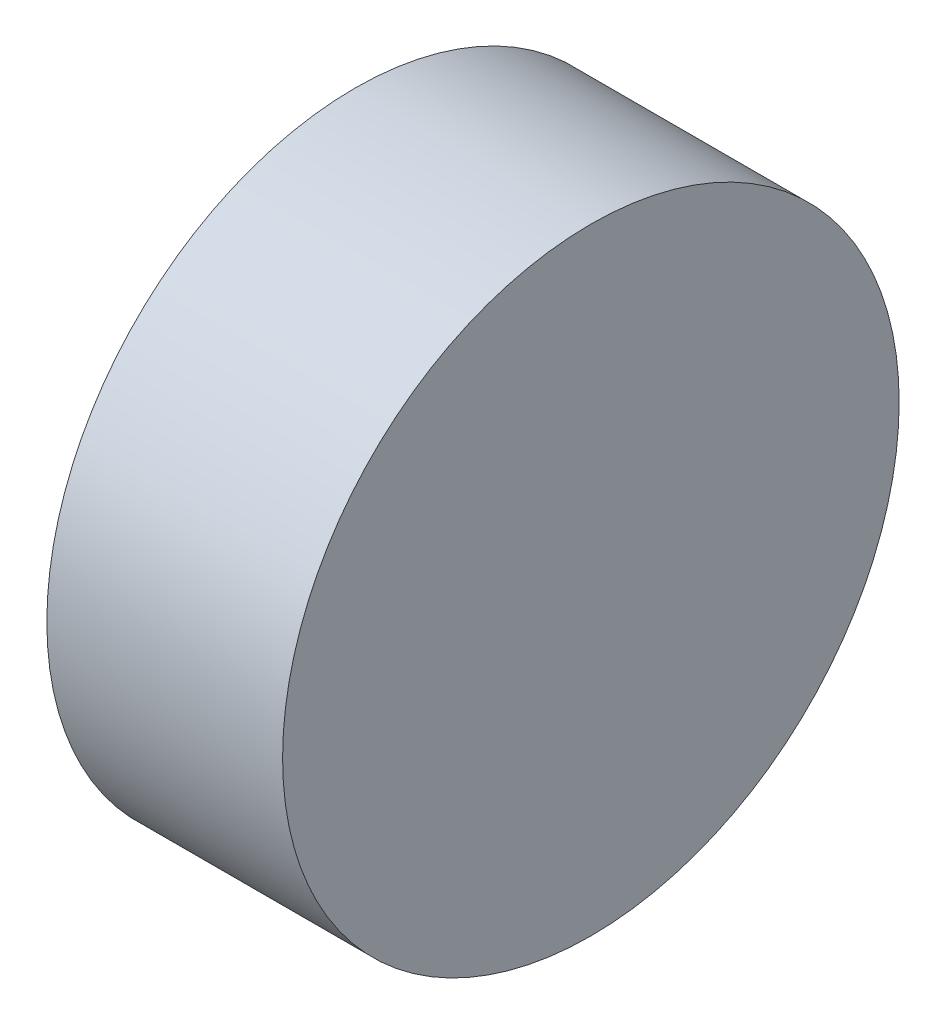
ISO-10303-21;
HEADER;
FILE_DESCRIPTION(('STEP AP214'),'2;1');
FILE_NAME('part.step','',(''),(''),'','','');
FILE_SCHEMA(('AUTOMOTIVE_DESIGN { 1 0 10303 214 1 1 1 1 }'));
ENDSEC;
DATA;
#1=APPLICATION_CONTEXT('core data for automotive mechanical design processes');
#2=APPLICATION_PROTOCOL_DEFINITION('international standard','automotive_design',2000,#1);
#3=PRODUCT_CONTEXT('',#1,'mechanical');
#4=PRODUCT('Part','Part','',(#3));
#5=PRODUCT_RELATED_PRODUCT_CATEGORY('part','',(#4));
#6=PRODUCT_DEFINITION_FORMATION('','',#4);
#7=PRODUCT_DEFINITION_CONTEXT('part definition',#1,'design');
#8=PRODUCT_DEFINITION('design','',#6,#7);
#9=PRODUCT_DEFINITION_SHAPE('','',#8);
#10=(LENGTH_UNIT() NAMED_UNIT(*) SI_UNIT(.MILLI.,.METRE.));
#11=(NAMED_UNIT(*) PLANE_ANGLE_UNIT() SI_UNIT($,.RADIAN.));
#12=(NAMED_UNIT(*) SI_UNIT($,.STERADIAN.) SOLID_ANGLE_UNIT());
#13=UNCERTAINTY_MEASURE_WITH_UNIT(LENGTH_MEASURE(1.E-05),#10,'distance_accuracy_value','');
#14=(GEOMETRIC_REPRESENTATION_CONTEXT(3) GLOBAL_UNCERTAINTY_ASSIGNED_CONTEXT((#13)) GLOBAL_UNIT_ASSIGNED_CONTEXT((#10,
#11,#12)) REPRESENTATION_CONTEXT('',''));
#15=CARTESIAN_POINT('',(0.,0.,0.));
#16=DIRECTION('',(0.,0.,1.));
#17=DIRECTION('',(1.,0.,0.));
#18=AXIS2_PLACEMENT_3D('',#15,#16,#17);
#19=CARTESIAN_POINT('',(26.,0.,0.));
#20=DIRECTION('',(-1.,0.,0.));
#21=DIRECTION('',(0.,0.,1.));
#22=AXIS2_PLACEMENT_3D('',#19,#20,#21);
#23=CYLINDRICAL_SURFACE('',#22,34.);
#24=CARTESIAN_POINT('',(26.,0.,0.));
#25=DIRECTION('',(1.,0.,0.));
#26=DIRECTION('',(0.,0.,-1.));
#27=AXIS2_PLACEMENT_3D('',#24,#25,#26);
#28=CIRCLE('',#27,34.);
#29=CARTESIAN_POINT('',(26.,0.,34.));
#30=VERTEX_POINT('',#29);
#31=EDGE_CURVE('E10',#30,#30,#28,.T.);
#32=CARTESIAN_POINT('',(0.,0.,0.));
#33=DIRECTION('',(1.,0.,0.));
#34=DIRECTION('',(0.,0.,-1.));
#35=AXIS2_PLACEMENT_3D('',#32,#33,#34);
#36=CIRCLE('',#35,34.);
#37=CARTESIAN_POINT('',(0.,0.,34.));
#38=VERTEX_POINT('',#37);
#39=EDGE_CURVE('E42',#38,#38,#36,.T.);
#40=CARTESIAN_POINT('',(26.,0.,34.));
#41=CARTESIAN_POINT('',(25.7291666666667,0.,34.));
#42=CARTESIAN_POINT('',(25.4583333333333,0.,34.));
#43=CARTESIAN_POINT('',(24.9166666666667,0.,34.));
#44=CARTESIAN_POINT('',(24.6458333333333,0.,34.));
#45=CARTESIAN_POINT('',(24.1041666666667,0.,34.));
#46=CARTESIAN_POINT('',(23.8333333333333,0.,34.));
#47=CARTESIAN_POINT('',(23.2916666666667,0.,34.));
#48=CARTESIAN_POINT('',(23.0208333333333,0.,34.));
#49=CARTESIAN_POINT('',(22.4791666666667,0.,34.));
#50=CARTESIAN_POINT('',(22.2083333333333,0.,34.));
#51=CARTESIAN_POINT('',(21.6666666666667,0.,34.));
#52=CARTESIAN_POINT('',(21.3958333333333,0.,34.));
#53=CARTESIAN_POINT('',(20.8541666666667,0.,34.));
#54=CARTESIAN_POINT('',(20.5833333333333,0.,34.));
#55=CARTESIAN_POINT('',(20.0416666666667,0.,34.));
#56=CARTESIAN_POINT('',(19.7708333333333,0.,34.));
#57=CARTESIAN_POINT('',(19.2291666666667,0.,34.));
#58=CARTESIAN_POINT('',(18.9583333333333,0.,34.));
#59=CARTESIAN_POINT('',(18.4166666666667,0.,34.));
#60=CARTESIAN_POINT('',(18.1458333333333,0.,34.));
#61=CARTESIAN_POINT('',(17.6041666666667,0.,34.));
#62=CARTESIAN_POINT('',(17.3333333333333,0.,34.));
#63=CARTESIAN_POINT('',(16.7916666666667,0.,34.));
#64=CARTESIAN_POINT('',(16.5208333333333,0.,34.));
#65=CARTESIAN_POINT('',(15.9791666666667,0.,34.));
#66=CARTESIAN_POINT('',(15.7083333333333,0.,34.));
#67=CARTESIAN_POINT('',(15.1666666666667,0.,34.));
#68=CARTESIAN_POINT('',(14.8958333333333,0.,34.));
#69=CARTESIAN_POINT('',(14.3541666666667,0.,34.));
#70=CARTESIAN_POINT('',(14.0833333333333,0.,34.));
#71=CARTESIAN_POINT('',(13.5416666666667,0.,34.));
#72=CARTESIAN_POINT('',(13.2708333333333,0.,34.));
#73=CARTESIAN_POINT('',(12.7291666666667,0.,34.));
#74=CARTESIAN_POINT('',(12.4583333333333,0.,34.));
#75=CARTESIAN_POINT('',(11.9166666666667,0.,34.));
#76=CARTESIAN_POINT('',(11.6458333333333,0.,34.));
#77=CARTESIAN_POINT('',(11.1041666666667,0.,34.));
#78=CARTESIAN_POINT('',(10.8333333333333,0.,34.));
#79=CARTESIAN_POINT('',(10.2916666666667,0.,34.));
#80=CARTESIAN_POINT('',(10.0208333333333,0.,34.));
#81=CARTESIAN_POINT('',(9.47916666666667,0.,34.));
#82=CARTESIAN_POINT('',(9.20833333333333,0.,34.));
#83=CARTESIAN_POINT('',(8.66666666666667,0.,34.));
#84=CARTESIAN_POINT('',(8.39583333333333,0.,34.));
#85=CARTESIAN_POINT('',(7.85416666666667,0.,34.));
#86=CARTESIAN_POINT('',(7.58333333333333,0.,34.));
#87=CARTESIAN_POINT('',(7.04166666666667,0.,34.));
#88=CARTESIAN_POINT('',(6.77083333333333,0.,34.));
#89=CARTESIAN_POINT('',(6.22916666666667,0.,34.));
#90=CARTESIAN_POINT('',(5.95833333333333,0.,34.));
#91=CARTESIAN_POINT('',(5.41666666666667,0.,34.));
#92=CARTESIAN_POINT('',(5.14583333333333,0.,34.));
#93=CARTESIAN_POINT('',(4.60416666666667,0.,34.));
#94=CARTESIAN_POINT('',(4.33333333333333,0.,34.));
#95=CARTESIAN_POINT('',(3.79166666666667,0.,34.));
#96=CARTESIAN_POINT('',(3.52083333333333,0.,34.));
#97=CARTESIAN_POINT('',(2.97916666666667,0.,34.));
#98=CARTESIAN_POINT('',(2.70833333333333,0.,34.));
#99=CARTESIAN_POINT('',(2.16666666666667,0.,34.));
#100=CARTESIAN_POINT('',(1.89583333333333,0.,34.));
#101=CARTESIAN_POINT('',(1.35416666666667,0.,34.));
#102=CARTESIAN_POINT('',(1.08333333333333,0.,34.));
#103=CARTESIAN_POINT('',(0.541666666666667,0.,34.));
#104=CARTESIAN_POINT('',(0.270833333333334,0.,34.));
#105=CARTESIAN_POINT('',(0.,0.,34.));
#106=B_SPLINE_CURVE_WITH_KNOTS('',3,(#40,#41,#42,#43,#44,#45,#46,#47,#48,#49,#50,#51,#52,#53,
#54,#55,#56,#57,#58,#59,#60,#61,#62,#63,#64,#65,#66,#67,#68,#69,#70,#71,#72,#73,#74,#75,#76,#77,
#78,#79,#80,#81,#82,#83,#84,#85,#86,#87,#88,#89,#90,#91,#92,#93,#94,#95,#96,#97,#98,#99,#100,
#101,#102,#103,#104,#105),.UNSPECIFIED.,.F.,.F.,(4,2,2,2,2,2,2,2,2,2,2,2,2,2,2,2,2,2,2,2,2,2,2,
2,2,2,2,2,2,2,2,2,4),(0.,0.812500000000001,1.625,2.4375,3.25,4.0625,4.875,5.6875,6.5,7.3125,
8.125,8.9375,9.75,10.5625,11.375,12.1875,13.,13.8125,14.625,15.4375,16.25,17.0625,17.875,
18.6875,19.5,20.3125,21.125,21.9375,22.75,23.5625,24.375,25.1875,26.),.UNSPECIFIED.);
#107=EDGE_CURVE('BSEAM39',#30,#38,#106,.T.);
#108=ORIENTED_EDGE('',*,*,#31,.F.);
#109=ORIENTED_EDGE('',*,*,#39,.T.);
#110=ORIENTED_EDGE('',*,*,#107,.T.);
#111=ORIENTED_EDGE('',*,*,#107,.F.);
#112=EDGE_LOOP('',(#108,#110,#109,#111));
#113=FACE_BOUND('',#112,.T.);
#114=ADVANCED_FACE('F39',(#113),#23,.T.);
#115=CARTESIAN_POINT('',(26.,0.,0.));
#116=DIRECTION('',(1.,0.,0.));
#117=DIRECTION('',(0.,0.,-1.));
#118=AXIS2_PLACEMENT_3D('',#115,#116,#117);
#119=PLANE('',#118);
#120=ORIENTED_EDGE('',*,*,#31,.T.);
#121=EDGE_LOOP('',(#120));
#122=FACE_BOUND('',#121,.T.);
#123=ADVANCED_FACE('F54',(#122),#119,.T.);
#124=CARTESIAN_POINT('',(0.,0.,0.));
#125=DIRECTION('',(1.,0.,0.));
#126=DIRECTION('',(0.,0.,-1.));
#127=AXIS2_PLACEMENT_3D('',#124,#125,#126);
#128=PLANE('',#127);
#129=ORIENTED_EDGE('',*,*,#39,.F.);
#130=EDGE_LOOP('',(#129));
#131=FACE_BOUND('',#130,.T.);
#132=ADVANCED_FACE('F52',(#131),#128,.F.);
#133=CLOSED_SHELL('',(#114,#123,#132));
#134=MANIFOLD_SOLID_BREP('B2',#133);
#135=ADVANCED_BREP_SHAPE_REPRESENTATION('',(#18,#134),#14);
#136=SHAPE_DEFINITION_REPRESENTATION(#9,#135);
ENDSEC;
END-ISO-10303-21;
